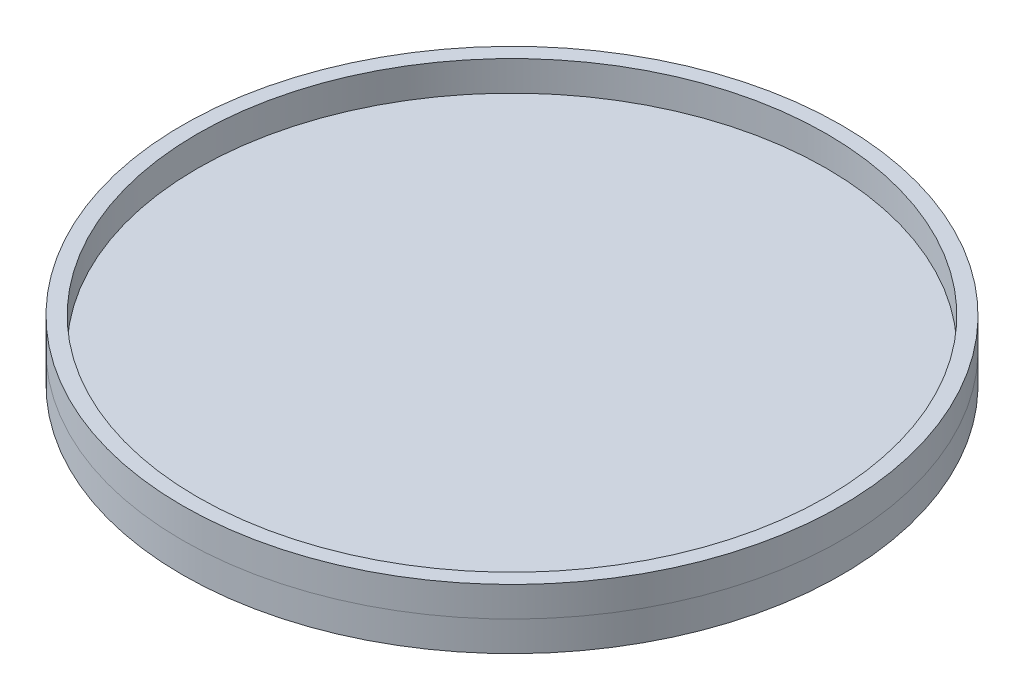
ISO-10303-21;
HEADER;
FILE_DESCRIPTION(('STEP AP214'),'2;1');
FILE_NAME('part.step','',(''),(''),'','','');
FILE_SCHEMA(('AUTOMOTIVE_DESIGN { 1 0 10303 214 1 1 1 1 }'));
ENDSEC;
DATA;
#1=APPLICATION_CONTEXT('core data for automotive mechanical design processes');
#2=APPLICATION_PROTOCOL_DEFINITION('international standard','automotive_design',2000,#1);
#3=PRODUCT_CONTEXT('',#1,'mechanical');
#4=PRODUCT('Part','Part','',(#3));
#5=PRODUCT_RELATED_PRODUCT_CATEGORY('part','',(#4));
#6=PRODUCT_DEFINITION_FORMATION('','',#4);
#7=PRODUCT_DEFINITION_CONTEXT('part definition',#1,'design');
#8=PRODUCT_DEFINITION('design','',#6,#7);
#9=PRODUCT_DEFINITION_SHAPE('','',#8);
#10=(LENGTH_UNIT() NAMED_UNIT(*) SI_UNIT(.MILLI.,.METRE.));
#11=(NAMED_UNIT(*) PLANE_ANGLE_UNIT() SI_UNIT($,.RADIAN.));
#12=(NAMED_UNIT(*) SI_UNIT($,.STERADIAN.) SOLID_ANGLE_UNIT());
#13=UNCERTAINTY_MEASURE_WITH_UNIT(LENGTH_MEASURE(1.E-05),#10,'distance_accuracy_value','');
#14=(GEOMETRIC_REPRESENTATION_CONTEXT(3) GLOBAL_UNCERTAINTY_ASSIGNED_CONTEXT((#13)) GLOBAL_UNIT_ASSIGNED_CONTEXT((#10,
#11,#12)) REPRESENTATION_CONTEXT('',''));
#15=CARTESIAN_POINT('',(0.,0.,0.));
#16=DIRECTION('',(0.,0.,1.));
#17=DIRECTION('',(1.,0.,0.));
#18=AXIS2_PLACEMENT_3D('',#15,#16,#17);
#19=CARTESIAN_POINT('',(25.6938172124433,31.1150134094887,50.74393548177));
#20=DIRECTION('',(0.,-1.,0.));
#21=DIRECTION('',(0.,0.,-1.));
#22=AXIS2_PLACEMENT_3D('',#19,#20,#21);
#23=CYLINDRICAL_SURFACE('',#22,33.);
#24=CARTESIAN_POINT('',(25.6938172124433,31.1150134094887,50.74393548177));
#25=DIRECTION('',(0.,-1.,0.));
#26=DIRECTION('',(0.,0.,-1.));
#27=AXIS2_PLACEMENT_3D('',#24,#25,#26);
#28=CIRCLE('',#27,33.);
#29=CARTESIAN_POINT('',(25.6938172124433,31.1150134094887,17.74393548177));
#30=VERTEX_POINT('',#29);
#31=EDGE_CURVE('P0_E10',#30,#30,#28,.T.);
#32=ORIENTED_EDGE('',*,*,#31,.T.);
#33=EDGE_LOOP('',(#32));
#34=FACE_BOUND('',#33,.T.);
#35=CARTESIAN_POINT('',(25.6938172124433,28.1150134094887,50.74393548177));
#36=DIRECTION('',(0.,-1.,0.));
#37=DIRECTION('',(0.,0.,-1.));
#38=AXIS2_PLACEMENT_3D('',#35,#36,#37);
#39=CIRCLE('',#38,33.);
#40=CARTESIAN_POINT('',(25.6938172124433,28.1150134094887,17.74393548177));
#41=VERTEX_POINT('',#40);
#42=EDGE_CURVE('P0_E41',#41,#41,#39,.T.);
#43=ORIENTED_EDGE('',*,*,#42,.F.);
#44=EDGE_LOOP('',(#43));
#45=FACE_BOUND('',#44,.T.);
#46=ADVANCED_FACE('P0_F35',(#34,#45),#23,.T.);
#47=CARTESIAN_POINT('',(58.6938172124433,31.1150134094887,50.74393548177));
#48=DIRECTION('',(0.,1.,0.));
#49=DIRECTION('',(0.,0.,1.));
#50=AXIS2_PLACEMENT_3D('',#47,#48,#49);
#51=PLANE('',#50);
#52=ORIENTED_EDGE('',*,*,#31,.F.);
#53=EDGE_LOOP('',(#52));
#54=FACE_BOUND('',#53,.T.);
#55=ADVANCED_FACE('P0_F50',(#54),#51,.T.);
#56=CARTESIAN_POINT('',(25.6938172124433,28.1150134094887,50.74393548177));
#57=DIRECTION('',(0.,-1.,0.));
#58=DIRECTION('',(0.,0.,-1.));
#59=AXIS2_PLACEMENT_3D('',#56,#57,#58);
#60=PLANE('',#59);
#61=ORIENTED_EDGE('',*,*,#42,.T.);
#62=EDGE_LOOP('',(#61));
#63=FACE_BOUND('',#62,.T.);
#64=ADVANCED_FACE('P0_F47',(#63),#60,.T.);
#65=CLOSED_SHELL('',(#46,#55,#64));
#66=MANIFOLD_SOLID_BREP('P0_B2',#65);
#67=CARTESIAN_POINT('',(25.6938172124433,34.1150134094887,50.74393548177));
#68=DIRECTION('',(0.,1.,0.));
#69=DIRECTION('',(0.,0.,1.));
#70=AXIS2_PLACEMENT_3D('',#67,#68,#69);
#71=PLANE('',#70);
#72=CARTESIAN_POINT('',(25.6938172124433,34.1150134094887,50.74393548177));
#73=DIRECTION('',(0.,1.,0.));
#74=DIRECTION('',(0.,0.,1.));
#75=AXIS2_PLACEMENT_3D('',#72,#73,#74);
#76=CIRCLE('',#75,33.);
#77=CARTESIAN_POINT('',(25.6938172124433,34.1150134094887,83.74393548177));
#78=VERTEX_POINT('',#77);
#79=EDGE_CURVE('P1_E10',#78,#78,#76,.T.);
#80=ORIENTED_EDGE('',*,*,#79,.T.);
#81=EDGE_LOOP('',(#80));
#82=FACE_BOUND('',#81,.T.);
#83=CARTESIAN_POINT('',(25.6938172124433,34.1150134094887,50.74393548177));
#84=DIRECTION('',(0.,1.,0.));
#85=DIRECTION('',(0.,0.,1.));
#86=AXIS2_PLACEMENT_3D('',#83,#84,#85);
#87=CIRCLE('',#86,31.5);
#88=CARTESIAN_POINT('',(25.6938172124433,34.1150134094887,82.24393548177));
#89=VERTEX_POINT('',#88);
#90=EDGE_CURVE('P1_E32',#89,#89,#87,.T.);
#91=ORIENTED_EDGE('',*,*,#90,.F.);
#92=EDGE_LOOP('',(#91));
#93=FACE_BOUND('',#92,.T.);
#94=ADVANCED_FACE('P1_F17',(#82,#93),#71,.T.);
#95=CARTESIAN_POINT('',(25.6938172124433,31.1150134094887,50.74393548177));
#96=DIRECTION('',(0.,1.,0.));
#97=DIRECTION('',(0.,0.,1.));
#98=AXIS2_PLACEMENT_3D('',#95,#96,#97);
#99=PLANE('',#98);
#100=CARTESIAN_POINT('',(25.6938172124433,31.1150134094887,50.74393548177));
#101=DIRECTION('',(0.,1.,0.));
#102=DIRECTION('',(0.,0.,1.));
#103=AXIS2_PLACEMENT_3D('',#100,#101,#102);
#104=CIRCLE('',#103,33.);
#105=CARTESIAN_POINT('',(25.6938172124433,31.1150134094887,83.74393548177));
#106=VERTEX_POINT('',#105);
#107=EDGE_CURVE('P1_E21',#106,#106,#104,.T.);
#108=ORIENTED_EDGE('',*,*,#107,.F.);
#109=EDGE_LOOP('',(#108));
#110=FACE_BOUND('',#109,.T.);
#111=CARTESIAN_POINT('',(25.6938172124433,31.1150134094887,50.74393548177));
#112=DIRECTION('',(0.,1.,0.));
#113=DIRECTION('',(0.,0.,1.));
#114=AXIS2_PLACEMENT_3D('',#111,#112,#113);
#115=CIRCLE('',#114,31.5);
#116=CARTESIAN_POINT('',(25.6938172124433,31.1150134094887,82.24393548177));
#117=VERTEX_POINT('',#116);
#118=EDGE_CURVE('P1_E34',#117,#117,#115,.T.);
#119=ORIENTED_EDGE('',*,*,#118,.T.);
#120=EDGE_LOOP('',(#119));
#121=FACE_BOUND('',#120,.T.);
#122=ADVANCED_FACE('P1_F48',(#110,#121),#99,.F.);
#123=CARTESIAN_POINT('',(25.6938172124433,34.1150134094887,50.74393548177));
#124=DIRECTION('',(0.,-1.,0.));
#125=DIRECTION('',(0.,0.,-1.));
#126=AXIS2_PLACEMENT_3D('',#123,#124,#125);
#127=CYLINDRICAL_SURFACE('',#126,33.);
#128=ORIENTED_EDGE('',*,*,#79,.F.);
#129=EDGE_LOOP('',(#128));
#130=FACE_BOUND('',#129,.T.);
#131=ORIENTED_EDGE('',*,*,#107,.T.);
#132=EDGE_LOOP('',(#131));
#133=FACE_BOUND('',#132,.T.);
#134=ADVANCED_FACE('P1_F19',(#130,#133),#127,.T.);
#135=CARTESIAN_POINT('',(25.6938172124433,34.1150134094887,50.74393548177));
#136=DIRECTION('',(0.,-1.,0.));
#137=DIRECTION('',(0.,0.,-1.));
#138=AXIS2_PLACEMENT_3D('',#135,#136,#137);
#139=CYLINDRICAL_SURFACE('',#138,31.5);
#140=ORIENTED_EDGE('',*,*,#90,.T.);
#141=EDGE_LOOP('',(#140));
#142=FACE_BOUND('',#141,.T.);
#143=ORIENTED_EDGE('',*,*,#118,.F.);
#144=EDGE_LOOP('',(#143));
#145=FACE_BOUND('',#144,.T.);
#146=ADVANCED_FACE('P1_F50',(#142,#145),#139,.F.);
#147=CLOSED_SHELL('',(#94,#122,#134,#146));
#148=MANIFOLD_SOLID_BREP('P1_B1',#147);
#149=ADVANCED_BREP_SHAPE_REPRESENTATION('',(#18,#66,#148),#14);
#150=SHAPE_DEFINITION_REPRESENTATION(#9,#149);
ENDSEC;
END-ISO-10303-21;
